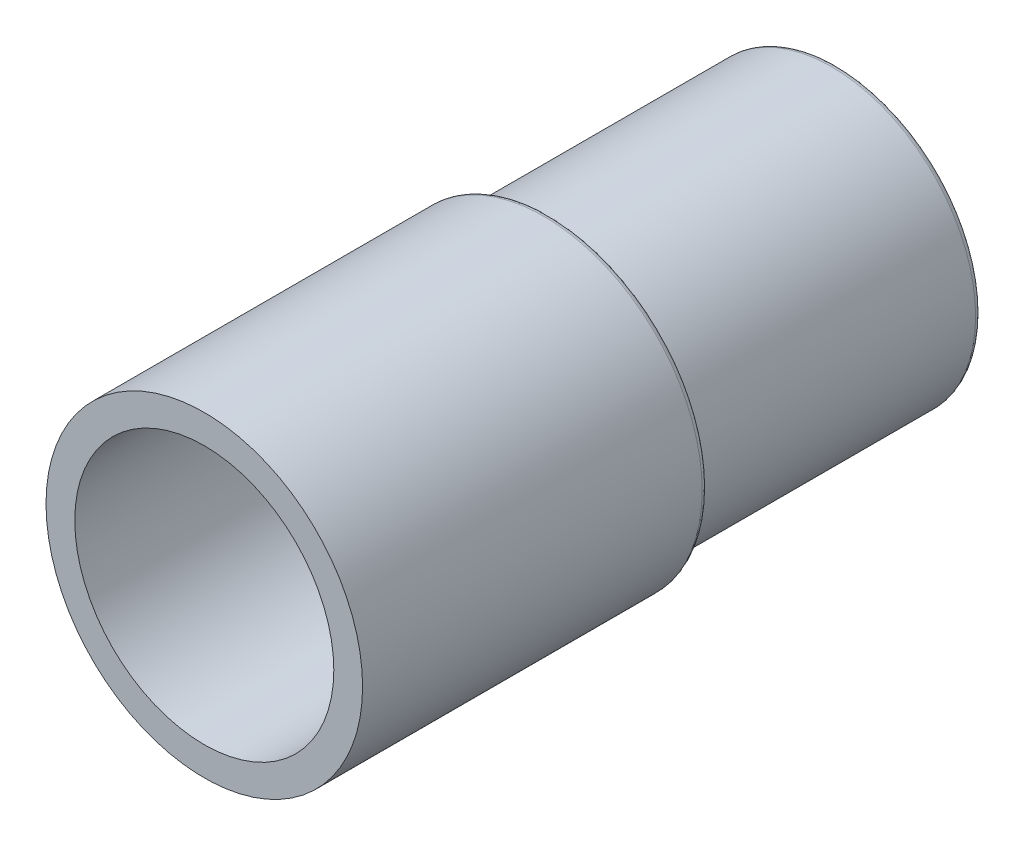
ISO-10303-21;
HEADER;
FILE_DESCRIPTION(('STEP AP214'),'2;1');
FILE_NAME('part.step','',(''),(''),'','','');
FILE_SCHEMA(('AUTOMOTIVE_DESIGN { 1 0 10303 214 1 1 1 1 }'));
ENDSEC;
DATA;
#1=APPLICATION_CONTEXT('core data for automotive mechanical design processes');
#2=APPLICATION_PROTOCOL_DEFINITION('international standard','automotive_design',2000,#1);
#3=PRODUCT_CONTEXT('',#1,'mechanical');
#4=PRODUCT('Part','Part','',(#3));
#5=PRODUCT_RELATED_PRODUCT_CATEGORY('part','',(#4));
#6=PRODUCT_DEFINITION_FORMATION('','',#4);
#7=PRODUCT_DEFINITION_CONTEXT('part definition',#1,'design');
#8=PRODUCT_DEFINITION('design','',#6,#7);
#9=PRODUCT_DEFINITION_SHAPE('','',#8);
#10=(LENGTH_UNIT() NAMED_UNIT(*) SI_UNIT(.MILLI.,.METRE.));
#11=(NAMED_UNIT(*) PLANE_ANGLE_UNIT() SI_UNIT($,.RADIAN.));
#12=(NAMED_UNIT(*) SI_UNIT($,.STERADIAN.) SOLID_ANGLE_UNIT());
#13=UNCERTAINTY_MEASURE_WITH_UNIT(LENGTH_MEASURE(1.E-05),#10,'distance_accuracy_value','');
#14=(GEOMETRIC_REPRESENTATION_CONTEXT(3) GLOBAL_UNCERTAINTY_ASSIGNED_CONTEXT((#13)) GLOBAL_UNIT_ASSIGNED_CONTEXT((#10,
#11,#12)) REPRESENTATION_CONTEXT('',''));
#15=CARTESIAN_POINT('',(0.,0.,0.));
#16=DIRECTION('',(0.,0.,1.));
#17=DIRECTION('',(1.,0.,0.));
#18=AXIS2_PLACEMENT_3D('',#15,#16,#17);
#19=CARTESIAN_POINT('',(0.,0.,5.));
#20=DIRECTION('',(0.,0.,1.));
#21=DIRECTION('',(1.,0.,0.));
#22=AXIS2_PLACEMENT_3D('',#19,#20,#21);
#23=PLANE('',#22);
#24=CARTESIAN_POINT('',(0.,0.,5.));
#25=DIRECTION('',(0.,0.,1.));
#26=DIRECTION('',(1.,0.,0.));
#27=AXIS2_PLACEMENT_3D('',#24,#25,#26);
#28=CIRCLE('',#27,2.25);
#29=CARTESIAN_POINT('',(2.25,0.,5.));
#30=VERTEX_POINT('',#29);
#31=EDGE_CURVE('E65',#30,#30,#28,.F.);
#32=ORIENTED_EDGE('',*,*,#31,.F.);
#33=EDGE_LOOP('',(#32));
#34=FACE_BOUND('',#33,.T.);
#35=CARTESIAN_POINT('',(0.,0.,5.));
#36=DIRECTION('',(0.,0.,1.));
#37=DIRECTION('',(1.,0.,0.));
#38=AXIS2_PLACEMENT_3D('',#35,#36,#37);
#39=CIRCLE('',#38,2.);
#40=CARTESIAN_POINT('',(2.,0.,5.));
#41=VERTEX_POINT('',#40);
#42=EDGE_CURVE('E68',#41,#41,#39,.T.);
#43=ORIENTED_EDGE('',*,*,#42,.F.);
#44=EDGE_LOOP('',(#43));
#45=FACE_BOUND('',#44,.T.);
#46=ADVANCED_FACE('F39',(#34,#45),#23,.T.);
#47=CARTESIAN_POINT('',(0.,0.,0.));
#48=DIRECTION('',(0.,0.,1.));
#49=DIRECTION('',(1.,0.,0.));
#50=AXIS2_PLACEMENT_3D('',#47,#48,#49);
#51=PLANE('',#50);
#52=CARTESIAN_POINT('',(0.,0.,0.));
#53=DIRECTION('',(0.,0.,1.));
#54=DIRECTION('',(1.,0.,0.));
#55=AXIS2_PLACEMENT_3D('',#52,#53,#54);
#56=CIRCLE('',#55,2.4);
#57=CARTESIAN_POINT('',(2.4,0.,0.));
#58=VERTEX_POINT('',#57);
#59=EDGE_CURVE('E12',#58,#58,#56,.F.);
#60=ORIENTED_EDGE('',*,*,#59,.T.);
#61=EDGE_LOOP('',(#60));
#62=FACE_BOUND('',#61,.T.);
#63=CARTESIAN_POINT('',(0.,0.,0.));
#64=DIRECTION('',(0.,0.,1.));
#65=DIRECTION('',(1.,0.,0.));
#66=AXIS2_PLACEMENT_3D('',#63,#64,#65);
#67=CIRCLE('',#66,2.);
#68=CARTESIAN_POINT('',(2.,0.,0.));
#69=VERTEX_POINT('',#68);
#70=EDGE_CURVE('E71',#69,#69,#67,.T.);
#71=ORIENTED_EDGE('',*,*,#70,.T.);
#72=EDGE_LOOP('',(#71));
#73=FACE_BOUND('',#72,.T.);
#74=ADVANCED_FACE('F100',(#62,#73),#51,.F.);
#75=CARTESIAN_POINT('',(0.,0.,5.));
#76=DIRECTION('',(0.,0.,-1.));
#77=DIRECTION('',(-1.,0.,0.));
#78=AXIS2_PLACEMENT_3D('',#75,#76,#77);
#79=CYLINDRICAL_SURFACE('',#78,2.5);
#80=CARTESIAN_POINT('',(0.,0.,0.1));
#81=DIRECTION('',(0.,0.,1.));
#82=DIRECTION('',(1.,0.,0.));
#83=AXIS2_PLACEMENT_3D('',#80,#81,#82);
#84=CIRCLE('',#83,2.5);
#85=CARTESIAN_POINT('',(2.5,0.,0.1));
#86=VERTEX_POINT('',#85);
#87=EDGE_CURVE('E46',#86,#86,#84,.T.);
#88=ORIENTED_EDGE('',*,*,#87,.T.);
#89=EDGE_LOOP('',(#88));
#90=FACE_BOUND('',#89,.T.);
#91=CARTESIAN_POINT('',(0.,0.,4.9));
#92=DIRECTION('',(0.,0.,1.));
#93=DIRECTION('',(1.,0.,0.));
#94=AXIS2_PLACEMENT_3D('',#91,#92,#93);
#95=CIRCLE('',#94,2.5);
#96=CARTESIAN_POINT('',(2.5,0.,4.9));
#97=VERTEX_POINT('',#96);
#98=EDGE_CURVE('E50',#97,#97,#95,.F.);
#99=ORIENTED_EDGE('',*,*,#98,.T.);
#100=EDGE_LOOP('',(#99));
#101=FACE_BOUND('',#100,.T.);
#102=ADVANCED_FACE('F41',(#90,#101),#79,.T.);
#103=CARTESIAN_POINT('',(0.,0.,5.));
#104=DIRECTION('',(0.,0.,-1.));
#105=DIRECTION('',(-1.,0.,0.));
#106=AXIS2_PLACEMENT_3D('',#103,#104,#105);
#107=CYLINDRICAL_SURFACE('',#106,2.);
#108=ORIENTED_EDGE('',*,*,#42,.T.);
#109=EDGE_LOOP('',(#108));
#110=FACE_BOUND('',#109,.T.);
#111=ORIENTED_EDGE('',*,*,#70,.F.);
#112=EDGE_LOOP('',(#111));
#113=FACE_BOUND('',#112,.T.);
#114=ADVANCED_FACE('F96',(#110,#113),#107,.F.);
#115=CARTESIAN_POINT('',(0.,0.,5.));
#116=DIRECTION('',(0.,0.,1.));
#117=DIRECTION('',(1.,0.,0.));
#118=AXIS2_PLACEMENT_3D('',#115,#116,#117);
#119=PLANE('',#118);
#120=CARTESIAN_POINT('',(0.,0.,5.));
#121=DIRECTION('',(0.,0.,1.));
#122=DIRECTION('',(1.,0.,0.));
#123=AXIS2_PLACEMENT_3D('',#120,#121,#122);
#124=CIRCLE('',#123,2.65);
#125=CARTESIAN_POINT('',(2.65,0.,5.));
#126=VERTEX_POINT('',#125);
#127=EDGE_CURVE('E54',#126,#126,#124,.F.);
#128=ORIENTED_EDGE('',*,*,#127,.T.);
#129=EDGE_LOOP('',(#128));
#130=FACE_BOUND('',#129,.T.);
#131=CARTESIAN_POINT('',(0.,0.,5.));
#132=DIRECTION('',(0.,0.,1.));
#133=DIRECTION('',(1.,0.,0.));
#134=AXIS2_PLACEMENT_3D('',#131,#132,#133);
#135=CIRCLE('',#134,2.6);
#136=CARTESIAN_POINT('',(2.6,0.,5.));
#137=VERTEX_POINT('',#136);
#138=EDGE_CURVE('E59',#137,#137,#135,.T.);
#139=ORIENTED_EDGE('',*,*,#138,.T.);
#140=EDGE_LOOP('',(#139));
#141=FACE_BOUND('',#140,.T.);
#142=ADVANCED_FACE('F87',(#130,#141),#119,.F.);
#143=CARTESIAN_POINT('',(0.,0.,11.));
#144=DIRECTION('',(0.,0.,1.));
#145=DIRECTION('',(1.,0.,0.));
#146=AXIS2_PLACEMENT_3D('',#143,#144,#145);
#147=PLANE('',#146);
#148=CARTESIAN_POINT('',(0.,0.,11.));
#149=DIRECTION('',(0.,0.,1.));
#150=DIRECTION('',(1.,0.,0.));
#151=AXIS2_PLACEMENT_3D('',#148,#149,#150);
#152=CIRCLE('',#151,2.75);
#153=CARTESIAN_POINT('',(2.75,0.,11.));
#154=VERTEX_POINT('',#153);
#155=EDGE_CURVE('E74',#154,#154,#152,.T.);
#156=ORIENTED_EDGE('',*,*,#155,.T.);
#157=EDGE_LOOP('',(#156));
#158=FACE_BOUND('',#157,.T.);
#159=CARTESIAN_POINT('',(0.,0.,11.));
#160=DIRECTION('',(0.,0.,1.));
#161=DIRECTION('',(1.,0.,0.));
#162=AXIS2_PLACEMENT_3D('',#159,#160,#161);
#163=CIRCLE('',#162,2.25);
#164=CARTESIAN_POINT('',(2.25,0.,11.));
#165=VERTEX_POINT('',#164);
#166=EDGE_CURVE('E77',#165,#165,#163,.T.);
#167=ORIENTED_EDGE('',*,*,#166,.F.);
#168=EDGE_LOOP('',(#167));
#169=FACE_BOUND('',#168,.T.);
#170=ADVANCED_FACE('F84',(#158,#169),#147,.T.);
#171=CARTESIAN_POINT('',(0.,0.,11.));
#172=DIRECTION('',(0.,0.,-1.));
#173=DIRECTION('',(-1.,0.,0.));
#174=AXIS2_PLACEMENT_3D('',#171,#172,#173);
#175=CYLINDRICAL_SURFACE('',#174,2.75);
#176=CARTESIAN_POINT('',(0.,0.,5.1));
#177=DIRECTION('',(0.,0.,1.));
#178=DIRECTION('',(1.,0.,0.));
#179=AXIS2_PLACEMENT_3D('',#176,#177,#178);
#180=CIRCLE('',#179,2.75);
#181=CARTESIAN_POINT('',(2.75,0.,5.1));
#182=VERTEX_POINT('',#181);
#183=EDGE_CURVE('E62',#182,#182,#180,.T.);
#184=ORIENTED_EDGE('',*,*,#183,.T.);
#185=EDGE_LOOP('',(#184));
#186=FACE_BOUND('',#185,.T.);
#187=ORIENTED_EDGE('',*,*,#155,.F.);
#188=EDGE_LOOP('',(#187));
#189=FACE_BOUND('',#188,.T.);
#190=ADVANCED_FACE('F86',(#186,#189),#175,.T.);
#191=CARTESIAN_POINT('',(0.,0.,11.));
#192=DIRECTION('',(0.,0.,-1.));
#193=DIRECTION('',(-1.,0.,0.));
#194=AXIS2_PLACEMENT_3D('',#191,#192,#193);
#195=CYLINDRICAL_SURFACE('',#194,2.25);
#196=ORIENTED_EDGE('',*,*,#166,.T.);
#197=EDGE_LOOP('',(#196));
#198=FACE_BOUND('',#197,.T.);
#199=ORIENTED_EDGE('',*,*,#31,.T.);
#200=EDGE_LOOP('',(#199));
#201=FACE_BOUND('',#200,.T.);
#202=ADVANCED_FACE('F81',(#198,#201),#195,.F.);
#203=CARTESIAN_POINT('',(0.,0.,5.1));
#204=DIRECTION('',(0.,0.,1.));
#205=DIRECTION('',(1.,0.,0.));
#206=AXIS2_PLACEMENT_3D('',#203,#204,#205);
#207=TOROIDAL_SURFACE('',#206,2.65,0.1);
#208=ORIENTED_EDGE('',*,*,#127,.F.);
#209=EDGE_LOOP('',(#208));
#210=FACE_BOUND('',#209,.T.);
#211=ORIENTED_EDGE('',*,*,#183,.F.);
#212=EDGE_LOOP('',(#211));
#213=FACE_BOUND('',#212,.T.);
#214=ADVANCED_FACE('F133',(#210,#213),#207,.T.);
#215=CARTESIAN_POINT('',(0.,0.,0.1));
#216=DIRECTION('',(0.,0.,1.));
#217=DIRECTION('',(1.,0.,0.));
#218=AXIS2_PLACEMENT_3D('',#215,#216,#217);
#219=TOROIDAL_SURFACE('',#218,2.4,0.1);
#220=ORIENTED_EDGE('',*,*,#59,.F.);
#221=EDGE_LOOP('',(#220));
#222=FACE_BOUND('',#221,.T.);
#223=ORIENTED_EDGE('',*,*,#87,.F.);
#224=EDGE_LOOP('',(#223));
#225=FACE_BOUND('',#224,.T.);
#226=ADVANCED_FACE('F126',(#222,#225),#219,.T.);
#227=CARTESIAN_POINT('',(0.,0.,4.9));
#228=DIRECTION('',(0.,0.,1.));
#229=DIRECTION('',(1.,0.,0.));
#230=AXIS2_PLACEMENT_3D('',#227,#228,#229);
#231=TOROIDAL_SURFACE('',#230,2.6,0.1);
#232=ORIENTED_EDGE('',*,*,#98,.F.);
#233=EDGE_LOOP('',(#232));
#234=FACE_BOUND('',#233,.T.);
#235=ORIENTED_EDGE('',*,*,#138,.F.);
#236=EDGE_LOOP('',(#235));
#237=FACE_BOUND('',#236,.T.);
#238=ADVANCED_FACE('F123',(#234,#237),#231,.F.);
#239=CLOSED_SHELL('',(#46,#74,#102,#114,#142,#170,#190,#202,#214,#226,#238));
#240=MANIFOLD_SOLID_BREP('B2',#239);
#241=ADVANCED_BREP_SHAPE_REPRESENTATION('',(#18,#240),#14);
#242=SHAPE_DEFINITION_REPRESENTATION(#9,#241);
ENDSEC;
END-ISO-10303-21;
